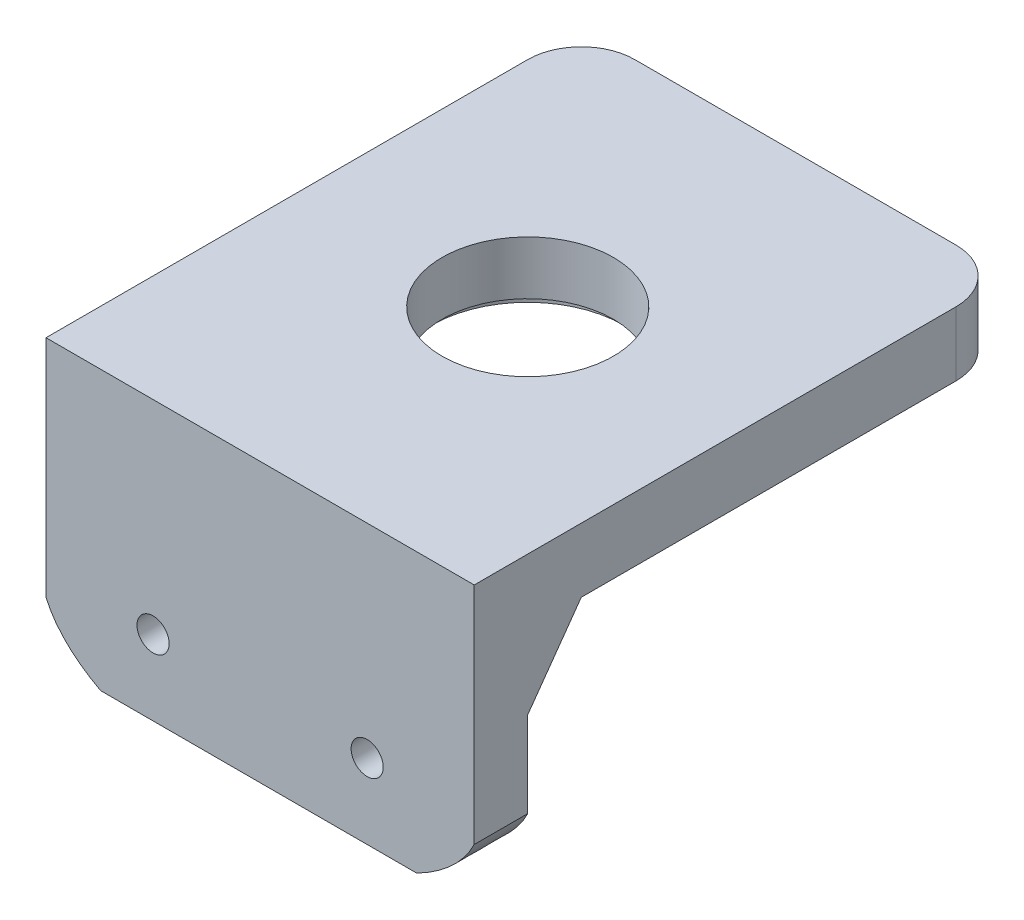
ISO-10303-21;
HEADER;
FILE_DESCRIPTION(('STEP AP214'),'2;1');
FILE_NAME('part.step','',(''),(''),'','','');
FILE_SCHEMA(('AUTOMOTIVE_DESIGN { 1 0 10303 214 1 1 1 1 }'));
ENDSEC;
DATA;
#1=APPLICATION_CONTEXT('core data for automotive mechanical design processes');
#2=APPLICATION_PROTOCOL_DEFINITION('international standard','automotive_design',2000,#1);
#3=PRODUCT_CONTEXT('',#1,'mechanical');
#4=PRODUCT('Part','Part','',(#3));
#5=PRODUCT_RELATED_PRODUCT_CATEGORY('part','',(#4));
#6=PRODUCT_DEFINITION_FORMATION('','',#4);
#7=PRODUCT_DEFINITION_CONTEXT('part definition',#1,'design');
#8=PRODUCT_DEFINITION('design','',#6,#7);
#9=PRODUCT_DEFINITION_SHAPE('','',#8);
#10=(LENGTH_UNIT() NAMED_UNIT(*) SI_UNIT(.MILLI.,.METRE.));
#11=(NAMED_UNIT(*) PLANE_ANGLE_UNIT() SI_UNIT($,.RADIAN.));
#12=(NAMED_UNIT(*) SI_UNIT($,.STERADIAN.) SOLID_ANGLE_UNIT());
#13=UNCERTAINTY_MEASURE_WITH_UNIT(LENGTH_MEASURE(1.E-05),#10,'distance_accuracy_value','');
#14=(GEOMETRIC_REPRESENTATION_CONTEXT(3) GLOBAL_UNCERTAINTY_ASSIGNED_CONTEXT((#13)) GLOBAL_UNIT_ASSIGNED_CONTEXT((#10,
#11,#12)) REPRESENTATION_CONTEXT('',''));
#15=CARTESIAN_POINT('',(0.,0.,0.));
#16=DIRECTION('',(0.,0.,1.));
#17=DIRECTION('',(1.,0.,0.));
#18=AXIS2_PLACEMENT_3D('',#15,#16,#17);
#19=CARTESIAN_POINT('',(0.,-3.,0.));
#20=DIRECTION('',(0.,1.,0.));
#21=DIRECTION('',(0.,0.,1.));
#22=AXIS2_PLACEMENT_3D('',#19,#20,#21);
#23=CYLINDRICAL_SURFACE('',#22,8.);
#24=CARTESIAN_POINT('',(0.,6.,0.));
#25=DIRECTION('',(0.,1.,0.));
#26=DIRECTION('',(0.,0.,1.));
#27=AXIS2_PLACEMENT_3D('',#24,#25,#26);
#28=CIRCLE('',#27,8.);
#29=CARTESIAN_POINT('',(0.,6.,8.));
#30=VERTEX_POINT('',#29);
#31=EDGE_CURVE('E156',#30,#30,#28,.T.);
#32=ORIENTED_EDGE('',*,*,#31,.T.);
#33=EDGE_LOOP('',(#32));
#34=FACE_BOUND('',#33,.T.);
#35=CARTESIAN_POINT('',(0.,1.,0.));
#36=DIRECTION('',(0.,-1.,0.));
#37=DIRECTION('',(0.,0.,-1.));
#38=AXIS2_PLACEMENT_3D('',#35,#36,#37);
#39=CIRCLE('',#38,8.);
#40=CARTESIAN_POINT('',(0.,1.,-8.));
#41=VERTEX_POINT('',#40);
#42=EDGE_CURVE('E42',#41,#41,#39,.F.);
#43=ORIENTED_EDGE('',*,*,#42,.F.);
#44=EDGE_LOOP('',(#43));
#45=FACE_BOUND('',#44,.T.);
#46=ADVANCED_FACE('F38',(#34,#45),#23,.F.);
#47=CARTESIAN_POINT('',(20.,6.,-25.));
#48=DIRECTION('',(-1.,0.,0.));
#49=DIRECTION('',(0.,0.,1.));
#50=AXIS2_PLACEMENT_3D('',#47,#48,#49);
#51=PLANE('',#50);
#52=DIRECTION('',(0.,-1.,0.));
#53=VECTOR('',#52,1.);
#54=CARTESIAN_POINT('',(20.,6.,25.));
#55=LINE('',#54,#53);
#56=CARTESIAN_POINT('',(20.,6.,25.));
#57=VERTEX_POINT('',#56);
#58=CARTESIAN_POINT('',(20.,-15.,25.));
#59=VERTEX_POINT('',#58);
#60=EDGE_CURVE('E47',#57,#59,#55,.T.);
#61=ORIENTED_EDGE('',*,*,#60,.T.);
#62=DIRECTION('',(0.,0.,-1.));
#63=VECTOR('',#62,1.);
#64=CARTESIAN_POINT('',(20.,-15.,25.));
#65=LINE('',#64,#63);
#66=CARTESIAN_POINT('',(20.,-15.,20.));
#67=VERTEX_POINT('',#66);
#68=EDGE_CURVE('E222',#59,#67,#65,.T.);
#69=ORIENTED_EDGE('',*,*,#68,.T.);
#70=DIRECTION('',(0.,1.,0.));
#71=VECTOR('',#70,1.);
#72=CARTESIAN_POINT('',(20.,-20.,20.));
#73=LINE('',#72,#71);
#74=CARTESIAN_POINT('',(20.,-7.,20.));
#75=VERTEX_POINT('',#74);
#76=EDGE_CURVE('E171',#67,#75,#73,.T.);
#77=ORIENTED_EDGE('',*,*,#76,.T.);
#78=DIRECTION('',(0.,0.813733471206735,-0.581238193719096));
#79=VECTOR('',#78,1.);
#80=CARTESIAN_POINT('',(20.,-7.,20.));
#81=LINE('',#80,#79);
#82=CARTESIAN_POINT('',(20.,0.,15.));
#83=VERTEX_POINT('',#82);
#84=EDGE_CURVE('E184',#75,#83,#81,.T.);
#85=ORIENTED_EDGE('',*,*,#84,.T.);
#86=DIRECTION('',(0.,0.,-1.));
#87=VECTOR('',#86,1.);
#88=CARTESIAN_POINT('',(20.,0.,-25.));
#89=LINE('',#88,#87);
#90=CARTESIAN_POINT('',(20.,0.,-20.));
#91=VERTEX_POINT('',#90);
#92=EDGE_CURVE('E152',#83,#91,#89,.T.);
#93=ORIENTED_EDGE('',*,*,#92,.T.);
#94=DIRECTION('',(0.,1.,0.));
#95=VECTOR('',#94,1.);
#96=CARTESIAN_POINT('',(20.,-20.,-20.));
#97=LINE('',#96,#95);
#98=CARTESIAN_POINT('',(20.,6.,-20.));
#99=VERTEX_POINT('',#98);
#100=EDGE_CURVE('E207',#91,#99,#97,.T.);
#101=ORIENTED_EDGE('',*,*,#100,.T.);
#102=DIRECTION('',(0.,0.,-1.));
#103=VECTOR('',#102,1.);
#104=CARTESIAN_POINT('',(20.,6.,-25.));
#105=LINE('',#104,#103);
#106=EDGE_CURVE('E160',#57,#99,#105,.T.);
#107=ORIENTED_EDGE('',*,*,#106,.F.);
#108=EDGE_LOOP('',(#61,#69,#77,#85,#93,#101,#107));
#109=FACE_BOUND('',#108,.T.);
#110=ADVANCED_FACE('F40',(#109),#51,.F.);
#111=CARTESIAN_POINT('',(-20.,6.,-25.));
#112=DIRECTION('',(0.,0.,1.));
#113=DIRECTION('',(1.,0.,0.));
#114=AXIS2_PLACEMENT_3D('',#111,#112,#113);
#115=PLANE('',#114);
#116=DIRECTION('',(0.,1.,0.));
#117=VECTOR('',#116,1.);
#118=CARTESIAN_POINT('',(-15.,-20.,-25.));
#119=LINE('',#118,#117);
#120=CARTESIAN_POINT('',(-15.,0.,-25.));
#121=VERTEX_POINT('',#120);
#122=CARTESIAN_POINT('',(-15.,6.,-25.));
#123=VERTEX_POINT('',#122);
#124=EDGE_CURVE('E215',#121,#123,#119,.T.);
#125=ORIENTED_EDGE('',*,*,#124,.T.);
#126=DIRECTION('',(-1.,0.,0.));
#127=VECTOR('',#126,1.);
#128=CARTESIAN_POINT('',(-20.,6.,-25.));
#129=LINE('',#128,#127);
#130=CARTESIAN_POINT('',(15.,6.,-25.));
#131=VERTEX_POINT('',#130);
#132=EDGE_CURVE('E148',#131,#123,#129,.T.);
#133=ORIENTED_EDGE('',*,*,#132,.F.);
#134=DIRECTION('',(0.,1.,0.));
#135=VECTOR('',#134,1.);
#136=CARTESIAN_POINT('',(15.,-20.,-25.));
#137=LINE('',#136,#135);
#138=CARTESIAN_POINT('',(15.,0.,-25.));
#139=VERTEX_POINT('',#138);
#140=EDGE_CURVE('E210',#139,#131,#137,.T.);
#141=ORIENTED_EDGE('',*,*,#140,.F.);
#142=DIRECTION('',(-1.,0.,0.));
#143=VECTOR('',#142,1.);
#144=CARTESIAN_POINT('',(-20.,0.,-25.));
#145=LINE('',#144,#143);
#146=EDGE_CURVE('E155',#139,#121,#145,.T.);
#147=ORIENTED_EDGE('',*,*,#146,.T.);
#148=EDGE_LOOP('',(#125,#133,#141,#147));
#149=FACE_BOUND('',#148,.T.);
#150=ADVANCED_FACE('F282',(#149),#115,.F.);
#151=CARTESIAN_POINT('',(0.,0.,0.));
#152=DIRECTION('',(0.,1.,0.));
#153=DIRECTION('',(0.,0.,1.));
#154=AXIS2_PLACEMENT_3D('',#151,#152,#153);
#155=PLANE('',#154);
#156=CARTESIAN_POINT('',(0.,0.,0.));
#157=DIRECTION('',(0.,-1.,0.));
#158=DIRECTION('',(0.,0.,-1.));
#159=AXIS2_PLACEMENT_3D('',#156,#157,#158);
#160=CIRCLE('',#159,9.);
#161=CARTESIAN_POINT('',(0.,0.,-9.));
#162=VERTEX_POINT('',#161);
#163=EDGE_CURVE('E318',#162,#162,#160,.T.);
#164=ORIENTED_EDGE('',*,*,#163,.F.);
#165=EDGE_LOOP('',(#164));
#166=FACE_BOUND('',#165,.T.);
#167=DIRECTION('',(0.,0.,1.));
#168=VECTOR('',#167,1.);
#169=CARTESIAN_POINT('',(-20.,0.,-25.));
#170=LINE('',#169,#168);
#171=CARTESIAN_POINT('',(-20.,0.,-20.));
#172=VERTEX_POINT('',#171);
#173=CARTESIAN_POINT('',(-20.,0.,15.));
#174=VERTEX_POINT('',#173);
#175=EDGE_CURVE('E159',#172,#174,#170,.T.);
#176=ORIENTED_EDGE('',*,*,#175,.F.);
#177=CARTESIAN_POINT('',(-15.,0.,-20.));
#178=DIRECTION('',(0.,1.,0.));
#179=DIRECTION('',(0.,0.,1.));
#180=AXIS2_PLACEMENT_3D('',#177,#178,#179);
#181=CIRCLE('',#180,5.);
#182=EDGE_CURVE('E193',#172,#121,#181,.F.);
#183=ORIENTED_EDGE('',*,*,#182,.T.);
#184=ORIENTED_EDGE('',*,*,#146,.F.);
#185=CARTESIAN_POINT('',(15.,0.,-20.));
#186=DIRECTION('',(0.,1.,0.));
#187=DIRECTION('',(0.,0.,1.));
#188=AXIS2_PLACEMENT_3D('',#185,#186,#187);
#189=CIRCLE('',#188,5.);
#190=EDGE_CURVE('E203',#139,#91,#189,.F.);
#191=ORIENTED_EDGE('',*,*,#190,.T.);
#192=ORIENTED_EDGE('',*,*,#92,.F.);
#193=DIRECTION('',(1.,0.,0.));
#194=VECTOR('',#193,1.);
#195=CARTESIAN_POINT('',(-20.,0.,15.));
#196=LINE('',#195,#194);
#197=EDGE_CURVE('E179',#174,#83,#196,.T.);
#198=ORIENTED_EDGE('',*,*,#197,.F.);
#199=EDGE_LOOP('',(#176,#183,#184,#191,#192,#198));
#200=FACE_BOUND('',#199,.T.);
#201=ADVANCED_FACE('F279',(#166,#200),#155,.F.);
#202=CARTESIAN_POINT('',(-20.,6.,-25.));
#203=DIRECTION('',(1.,0.,0.));
#204=DIRECTION('',(0.,0.,-1.));
#205=AXIS2_PLACEMENT_3D('',#202,#203,#204);
#206=PLANE('',#205);
#207=DIRECTION('',(0.,1.,0.));
#208=VECTOR('',#207,1.);
#209=CARTESIAN_POINT('',(-20.,-20.,20.));
#210=LINE('',#209,#208);
#211=CARTESIAN_POINT('',(-20.,-15.,20.));
#212=VERTEX_POINT('',#211);
#213=CARTESIAN_POINT('',(-20.,-7.,20.));
#214=VERTEX_POINT('',#213);
#215=EDGE_CURVE('E136',#212,#214,#210,.T.);
#216=ORIENTED_EDGE('',*,*,#215,.F.);
#217=DIRECTION('',(0.,0.,-1.));
#218=VECTOR('',#217,1.);
#219=CARTESIAN_POINT('',(-20.,-15.,25.));
#220=LINE('',#219,#218);
#221=CARTESIAN_POINT('',(-20.,-15.,25.));
#222=VERTEX_POINT('',#221);
#223=EDGE_CURVE('E123',#222,#212,#220,.T.);
#224=ORIENTED_EDGE('',*,*,#223,.F.);
#225=DIRECTION('',(0.,-1.,0.));
#226=VECTOR('',#225,1.);
#227=CARTESIAN_POINT('',(-20.,6.,25.));
#228=LINE('',#227,#226);
#229=CARTESIAN_POINT('',(-20.,6.,25.));
#230=VERTEX_POINT('',#229);
#231=EDGE_CURVE('E11',#230,#222,#228,.T.);
#232=ORIENTED_EDGE('',*,*,#231,.F.);
#233=DIRECTION('',(0.,0.,1.));
#234=VECTOR('',#233,1.);
#235=CARTESIAN_POINT('',(-20.,6.,-25.));
#236=LINE('',#235,#234);
#237=CARTESIAN_POINT('',(-20.,6.,-20.));
#238=VERTEX_POINT('',#237);
#239=EDGE_CURVE('E145',#238,#230,#236,.T.);
#240=ORIENTED_EDGE('',*,*,#239,.F.);
#241=DIRECTION('',(0.,1.,0.));
#242=VECTOR('',#241,1.);
#243=CARTESIAN_POINT('',(-20.,-20.,-20.));
#244=LINE('',#243,#242);
#245=EDGE_CURVE('E206',#172,#238,#244,.T.);
#246=ORIENTED_EDGE('',*,*,#245,.F.);
#247=ORIENTED_EDGE('',*,*,#175,.T.);
#248=DIRECTION('',(0.,0.813733471206735,-0.581238193719096));
#249=VECTOR('',#248,1.);
#250=CARTESIAN_POINT('',(-20.,-7.,20.));
#251=LINE('',#250,#249);
#252=EDGE_CURVE('E181',#214,#174,#251,.T.);
#253=ORIENTED_EDGE('',*,*,#252,.F.);
#254=EDGE_LOOP('',(#216,#224,#232,#240,#246,#247,#253));
#255=FACE_BOUND('',#254,.T.);
#256=ADVANCED_FACE('F132',(#255),#206,.F.);
#257=CARTESIAN_POINT('',(-20.,6.,25.));
#258=DIRECTION('',(0.,0.,-1.));
#259=DIRECTION('',(-1.,0.,0.));
#260=AXIS2_PLACEMENT_3D('',#257,#258,#259);
#261=PLANE('',#260);
#262=CARTESIAN_POINT('',(-10.,-13.,25.));
#263=DIRECTION('',(0.,0.,-1.));
#264=DIRECTION('',(-1.,0.,0.));
#265=AXIS2_PLACEMENT_3D('',#262,#263,#264);
#266=CIRCLE('',#265,1.5);
#267=CARTESIAN_POINT('',(-11.5,-13.,25.));
#268=VERTEX_POINT('',#267);
#269=EDGE_CURVE('E187',#268,#268,#266,.T.);
#270=ORIENTED_EDGE('',*,*,#269,.T.);
#271=EDGE_LOOP('',(#270));
#272=FACE_BOUND('',#271,.T.);
#273=CARTESIAN_POINT('',(9.99999999999999,-13.,25.));
#274=DIRECTION('',(0.,0.,-1.));
#275=DIRECTION('',(-1.,0.,0.));
#276=AXIS2_PLACEMENT_3D('',#273,#274,#275);
#277=CIRCLE('',#276,1.5);
#278=CARTESIAN_POINT('',(8.49999999999999,-13.,25.));
#279=VERTEX_POINT('',#278);
#280=EDGE_CURVE('E192',#279,#279,#277,.T.);
#281=ORIENTED_EDGE('',*,*,#280,.T.);
#282=EDGE_LOOP('',(#281));
#283=FACE_BOUND('',#282,.T.);
#284=ORIENTED_EDGE('',*,*,#231,.T.);
#285=CARTESIAN_POINT('',(-20.,-15.,25.));
#286=CARTESIAN_POINT('',(-15.2917895868543,-25.8046758038839,25.));
#287=CARTESIAN_POINT('',(14.7082104131458,-25.8046758038839,25.));
#288=CARTESIAN_POINT('',(20.,-15.,25.));
#289=B_SPLINE_CURVE_WITH_KNOTS('',3,(#285,#286,#287,#288),.UNSPECIFIED.,.F.,.F.,(4,4),(0.,1.),.UNSPECIFIED.);
#290=CARTESIAN_POINT('',(-14.8986861862667,-20.,25.));
#291=VERTEX_POINT('',#290);
#292=EDGE_CURVE('E120',#222,#291,#289,.T.);
#293=ORIENTED_EDGE('',*,*,#292,.T.);
#294=DIRECTION('',(-1.,0.,0.));
#295=VECTOR('',#294,1.);
#296=CARTESIAN_POINT('',(20.,-20.,25.));
#297=LINE('',#296,#295);
#298=CARTESIAN_POINT('',(14.6286275633485,-20.,25.));
#299=VERTEX_POINT('',#298);
#300=EDGE_CURVE('E176',#299,#291,#297,.T.);
#301=ORIENTED_EDGE('',*,*,#300,.F.);
#302=CARTESIAN_POINT('',(-20.,-15.,25.));
#303=CARTESIAN_POINT('',(-15.2917895868543,-25.8046758038839,25.));
#304=CARTESIAN_POINT('',(14.7082104131458,-25.8046758038839,25.));
#305=CARTESIAN_POINT('',(20.,-15.,25.));
#306=B_SPLINE_CURVE_WITH_KNOTS('',3,(#302,#303,#304,#305),.UNSPECIFIED.,.F.,.F.,(4,4),(0.,1.),.UNSPECIFIED.);
#307=EDGE_CURVE('E62',#299,#59,#306,.T.);
#308=ORIENTED_EDGE('',*,*,#307,.T.);
#309=ORIENTED_EDGE('',*,*,#60,.F.);
#310=DIRECTION('',(1.,0.,0.));
#311=VECTOR('',#310,1.);
#312=CARTESIAN_POINT('',(-20.,6.,25.));
#313=LINE('',#312,#311);
#314=EDGE_CURVE('E140',#230,#57,#313,.T.);
#315=ORIENTED_EDGE('',*,*,#314,.F.);
#316=EDGE_LOOP('',(#284,#293,#301,#308,#309,#315));
#317=FACE_BOUND('',#316,.T.);
#318=ADVANCED_FACE('F138',(#272,#283,#317),#261,.F.);
#319=CARTESIAN_POINT('',(0.,6.,0.));
#320=DIRECTION('',(0.,1.,0.));
#321=DIRECTION('',(0.,0.,1.));
#322=AXIS2_PLACEMENT_3D('',#319,#320,#321);
#323=PLANE('',#322);
#324=CARTESIAN_POINT('',(-15.,6.,-20.));
#325=DIRECTION('',(0.,-1.,0.));
#326=DIRECTION('',(0.,0.,1.));
#327=AXIS2_PLACEMENT_3D('',#324,#325,#326);
#328=CIRCLE('',#327,5.);
#329=EDGE_CURVE('E213',#238,#123,#328,.T.);
#330=ORIENTED_EDGE('',*,*,#329,.F.);
#331=ORIENTED_EDGE('',*,*,#239,.T.);
#332=ORIENTED_EDGE('',*,*,#314,.T.);
#333=ORIENTED_EDGE('',*,*,#106,.T.);
#334=CARTESIAN_POINT('',(15.,6.,-20.));
#335=DIRECTION('',(0.,-1.,0.));
#336=DIRECTION('',(0.,0.,1.));
#337=AXIS2_PLACEMENT_3D('',#334,#335,#336);
#338=CIRCLE('',#337,5.);
#339=EDGE_CURVE('E211',#131,#99,#338,.T.);
#340=ORIENTED_EDGE('',*,*,#339,.F.);
#341=ORIENTED_EDGE('',*,*,#132,.T.);
#342=EDGE_LOOP('',(#330,#331,#332,#333,#340,#341));
#343=FACE_BOUND('',#342,.T.);
#344=ORIENTED_EDGE('',*,*,#31,.F.);
#345=EDGE_LOOP('',(#344));
#346=FACE_BOUND('',#345,.T.);
#347=ADVANCED_FACE('F272',(#343,#346),#323,.T.);
#348=CARTESIAN_POINT('',(20.,-20.,20.));
#349=DIRECTION('',(0.,0.,1.));
#350=DIRECTION('',(1.,0.,0.));
#351=AXIS2_PLACEMENT_3D('',#348,#349,#350);
#352=PLANE('',#351);
#353=CARTESIAN_POINT('',(-10.,-13.,20.));
#354=DIRECTION('',(0.,0.,-1.));
#355=DIRECTION('',(-1.,0.,0.));
#356=AXIS2_PLACEMENT_3D('',#353,#354,#355);
#357=CIRCLE('',#356,1.5);
#358=CARTESIAN_POINT('',(-11.5,-13.,20.));
#359=VERTEX_POINT('',#358);
#360=EDGE_CURVE('E196',#359,#359,#357,.T.);
#361=ORIENTED_EDGE('',*,*,#360,.F.);
#362=EDGE_LOOP('',(#361));
#363=FACE_BOUND('',#362,.T.);
#364=CARTESIAN_POINT('',(10.,-13.,20.));
#365=DIRECTION('',(0.,0.,-1.));
#366=DIRECTION('',(-1.,0.,0.));
#367=AXIS2_PLACEMENT_3D('',#364,#365,#366);
#368=CIRCLE('',#367,1.5);
#369=CARTESIAN_POINT('',(8.5,-13.,20.));
#370=VERTEX_POINT('',#369);
#371=EDGE_CURVE('E189',#370,#370,#368,.T.);
#372=ORIENTED_EDGE('',*,*,#371,.F.);
#373=EDGE_LOOP('',(#372));
#374=FACE_BOUND('',#373,.T.);
#375=DIRECTION('',(1.,0.,0.));
#376=VECTOR('',#375,1.);
#377=CARTESIAN_POINT('',(20.,-20.,20.));
#378=LINE('',#377,#376);
#379=CARTESIAN_POINT('',(-14.8986861862667,-20.,20.));
#380=VERTEX_POINT('',#379);
#381=CARTESIAN_POINT('',(14.6286275633485,-20.,20.));
#382=VERTEX_POINT('',#381);
#383=EDGE_CURVE('E173',#380,#382,#378,.T.);
#384=ORIENTED_EDGE('',*,*,#383,.F.);
#385=CARTESIAN_POINT('',(-20.,-15.,20.));
#386=CARTESIAN_POINT('',(-15.2917895868543,-25.8046758038839,20.));
#387=CARTESIAN_POINT('',(14.7082104131458,-25.8046758038839,20.));
#388=CARTESIAN_POINT('',(20.,-15.,20.));
#389=B_SPLINE_CURVE_WITH_KNOTS('',3,(#385,#386,#387,#388),.UNSPECIFIED.,.F.,.F.,(4,4),(0.,1.),.UNSPECIFIED.);
#390=EDGE_CURVE('E54',#212,#380,#389,.T.);
#391=ORIENTED_EDGE('',*,*,#390,.F.);
#392=ORIENTED_EDGE('',*,*,#215,.T.);
#393=DIRECTION('',(1.,0.,0.));
#394=VECTOR('',#393,1.);
#395=CARTESIAN_POINT('',(-20.,-7.,20.));
#396=LINE('',#395,#394);
#397=EDGE_CURVE('E178',#214,#75,#396,.T.);
#398=ORIENTED_EDGE('',*,*,#397,.T.);
#399=ORIENTED_EDGE('',*,*,#76,.F.);
#400=CARTESIAN_POINT('',(-20.,-15.,20.));
#401=CARTESIAN_POINT('',(-15.2917895868543,-25.8046758038839,20.));
#402=CARTESIAN_POINT('',(14.7082104131458,-25.8046758038839,20.));
#403=CARTESIAN_POINT('',(20.,-15.,20.));
#404=B_SPLINE_CURVE_WITH_KNOTS('',3,(#400,#401,#402,#403),.UNSPECIFIED.,.F.,.F.,(4,4),(0.,1.),.UNSPECIFIED.);
#405=EDGE_CURVE('E225',#382,#67,#404,.T.);
#406=ORIENTED_EDGE('',*,*,#405,.F.);
#407=EDGE_LOOP('',(#384,#391,#392,#398,#399,#406));
#408=FACE_BOUND('',#407,.T.);
#409=ADVANCED_FACE('F268',(#363,#374,#408),#352,.F.);
#410=CARTESIAN_POINT('',(0.,-20.,0.));
#411=DIRECTION('',(0.,1.,0.));
#412=DIRECTION('',(0.,0.,1.));
#413=AXIS2_PLACEMENT_3D('',#410,#411,#412);
#414=PLANE('',#413);
#415=ORIENTED_EDGE('',*,*,#300,.T.);
#416=DIRECTION('',(0.,0.,-1.));
#417=VECTOR('',#416,1.);
#418=CARTESIAN_POINT('',(-14.8986861862667,-20.,25.));
#419=LINE('',#418,#417);
#420=EDGE_CURVE('E124',#291,#380,#419,.T.);
#421=ORIENTED_EDGE('',*,*,#420,.T.);
#422=ORIENTED_EDGE('',*,*,#383,.T.);
#423=DIRECTION('',(0.,0.,-1.));
#424=VECTOR('',#423,1.);
#425=CARTESIAN_POINT('',(14.6286275633485,-20.,25.));
#426=LINE('',#425,#424);
#427=EDGE_CURVE('E220',#299,#382,#426,.T.);
#428=ORIENTED_EDGE('',*,*,#427,.F.);
#429=EDGE_LOOP('',(#415,#421,#422,#428));
#430=FACE_BOUND('',#429,.T.);
#431=ADVANCED_FACE('F264',(#430),#414,.F.);
#432=CARTESIAN_POINT('',(-20.,-7.,20.));
#433=DIRECTION('',(0.,-0.581238193719096,-0.813733471206735));
#434=DIRECTION('',(0.,0.813733471206735,-0.581238193719096));
#435=AXIS2_PLACEMENT_3D('',#432,#433,#434);
#436=PLANE('',#435);
#437=ORIENTED_EDGE('',*,*,#84,.F.);
#438=ORIENTED_EDGE('',*,*,#397,.F.);
#439=ORIENTED_EDGE('',*,*,#252,.T.);
#440=ORIENTED_EDGE('',*,*,#197,.T.);
#441=EDGE_LOOP('',(#437,#438,#439,#440));
#442=FACE_BOUND('',#441,.T.);
#443=ADVANCED_FACE('F260',(#442),#436,.T.);
#444=CARTESIAN_POINT('',(9.99999999999999,-13.,25.));
#445=DIRECTION('',(0.,0.,-1.));
#446=DIRECTION('',(-1.,0.,0.));
#447=AXIS2_PLACEMENT_3D('',#444,#445,#446);
#448=CYLINDRICAL_SURFACE('',#447,1.5);
#449=ORIENTED_EDGE('',*,*,#280,.F.);
#450=EDGE_LOOP('',(#449));
#451=FACE_BOUND('',#450,.T.);
#452=ORIENTED_EDGE('',*,*,#371,.T.);
#453=EDGE_LOOP('',(#452));
#454=FACE_BOUND('',#453,.T.);
#455=ADVANCED_FACE('F256',(#451,#454),#448,.F.);
#456=CARTESIAN_POINT('',(-10.,-13.,25.));
#457=DIRECTION('',(0.,0.,-1.));
#458=DIRECTION('',(-1.,0.,0.));
#459=AXIS2_PLACEMENT_3D('',#456,#457,#458);
#460=CYLINDRICAL_SURFACE('',#459,1.5);
#461=ORIENTED_EDGE('',*,*,#269,.F.);
#462=EDGE_LOOP('',(#461));
#463=FACE_BOUND('',#462,.T.);
#464=ORIENTED_EDGE('',*,*,#360,.T.);
#465=EDGE_LOOP('',(#464));
#466=FACE_BOUND('',#465,.T.);
#467=ADVANCED_FACE('F252',(#463,#466),#460,.F.);
#468=CARTESIAN_POINT('',(15.,-20.,-20.));
#469=DIRECTION('',(0.,1.,0.));
#470=DIRECTION('',(0.,0.,1.));
#471=AXIS2_PLACEMENT_3D('',#468,#469,#470);
#472=CYLINDRICAL_SURFACE('',#471,5.);
#473=ORIENTED_EDGE('',*,*,#140,.T.);
#474=ORIENTED_EDGE('',*,*,#339,.T.);
#475=ORIENTED_EDGE('',*,*,#100,.F.);
#476=ORIENTED_EDGE('',*,*,#190,.F.);
#477=EDGE_LOOP('',(#473,#474,#475,#476));
#478=FACE_BOUND('',#477,.T.);
#479=ADVANCED_FACE('F248',(#478),#472,.T.);
#480=CARTESIAN_POINT('',(-15.,-20.,-20.));
#481=DIRECTION('',(0.,1.,0.));
#482=DIRECTION('',(0.,0.,1.));
#483=AXIS2_PLACEMENT_3D('',#480,#481,#482);
#484=CYLINDRICAL_SURFACE('',#483,5.);
#485=ORIENTED_EDGE('',*,*,#245,.T.);
#486=ORIENTED_EDGE('',*,*,#329,.T.);
#487=ORIENTED_EDGE('',*,*,#124,.F.);
#488=ORIENTED_EDGE('',*,*,#182,.F.);
#489=EDGE_LOOP('',(#485,#486,#487,#488));
#490=FACE_BOUND('',#489,.T.);
#491=ADVANCED_FACE('F244',(#490),#484,.T.);
#492=DIRECTION('',(0.,0.,-1.));
#493=VECTOR('',#492,1.);
#494=SURFACE_OF_LINEAR_EXTRUSION('',#306,#493);
#495=ORIENTED_EDGE('',*,*,#405,.T.);
#496=ORIENTED_EDGE('',*,*,#68,.F.);
#497=ORIENTED_EDGE('',*,*,#307,.F.);
#498=ORIENTED_EDGE('',*,*,#427,.T.);
#499=EDGE_LOOP('',(#495,#496,#497,#498));
#500=FACE_BOUND('',#499,.T.);
#501=ADVANCED_FACE('F240',(#500),#494,.F.);
#502=DIRECTION('',(0.,0.,-1.));
#503=VECTOR('',#502,1.);
#504=SURFACE_OF_LINEAR_EXTRUSION('',#289,#503);
#505=ORIENTED_EDGE('',*,*,#390,.T.);
#506=ORIENTED_EDGE('',*,*,#420,.F.);
#507=ORIENTED_EDGE('',*,*,#292,.F.);
#508=ORIENTED_EDGE('',*,*,#223,.T.);
#509=EDGE_LOOP('',(#505,#506,#507,#508));
#510=FACE_BOUND('',#509,.T.);
#511=ADVANCED_FACE('F122',(#510),#504,.F.);
#512=CARTESIAN_POINT('',(0.,1.,0.));
#513=DIRECTION('',(0.,-1.,0.));
#514=DIRECTION('',(0.,0.,-1.));
#515=AXIS2_PLACEMENT_3D('',#512,#513,#514);
#516=PLANE('',#515);
#517=CARTESIAN_POINT('',(0.,1.,0.));
#518=DIRECTION('',(0.,-1.,0.));
#519=DIRECTION('',(0.,0.,-1.));
#520=AXIS2_PLACEMENT_3D('',#517,#518,#519);
#521=CIRCLE('',#520,9.);
#522=CARTESIAN_POINT('',(0.,1.,-9.));
#523=VERTEX_POINT('',#522);
#524=EDGE_CURVE('E324',#523,#523,#521,.T.);
#525=ORIENTED_EDGE('',*,*,#524,.T.);
#526=EDGE_LOOP('',(#525));
#527=FACE_BOUND('',#526,.T.);
#528=ORIENTED_EDGE('',*,*,#42,.T.);
#529=EDGE_LOOP('',(#528));
#530=FACE_BOUND('',#529,.T.);
#531=ADVANCED_FACE('F331',(#527,#530),#516,.T.);
#532=CARTESIAN_POINT('',(0.,1.,0.));
#533=DIRECTION('',(0.,-1.,0.));
#534=DIRECTION('',(0.,0.,-1.));
#535=AXIS2_PLACEMENT_3D('',#532,#533,#534);
#536=CYLINDRICAL_SURFACE('',#535,9.);
#537=ORIENTED_EDGE('',*,*,#524,.F.);
#538=EDGE_LOOP('',(#537));
#539=FACE_BOUND('',#538,.T.);
#540=ORIENTED_EDGE('',*,*,#163,.T.);
#541=EDGE_LOOP('',(#540));
#542=FACE_BOUND('',#541,.T.);
#543=ADVANCED_FACE('F334',(#539,#542),#536,.F.);
#544=CLOSED_SHELL('',(#46,#110,#150,#201,#256,#318,#347,#409,#431,#443,#455,#467,#479,#491,#501,
#511,#531,#543));
#545=MANIFOLD_SOLID_BREP('B2',#544);
#546=ADVANCED_BREP_SHAPE_REPRESENTATION('',(#18,#545),#14);
#547=SHAPE_DEFINITION_REPRESENTATION(#9,#546);
ENDSEC;
END-ISO-10303-21;
